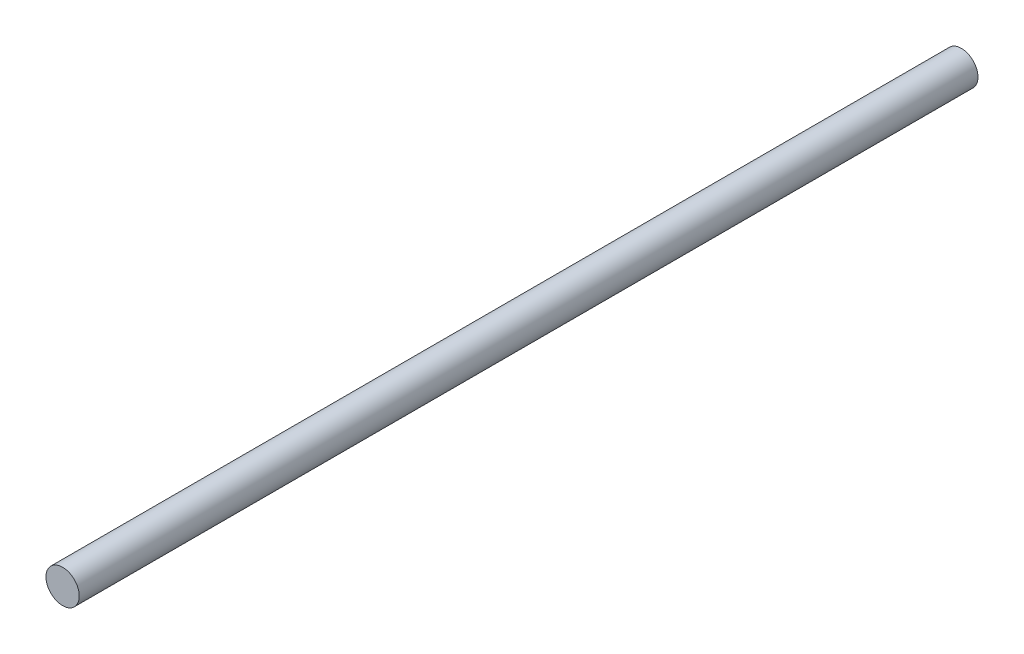
ISO-10303-21;
HEADER;
FILE_DESCRIPTION(('STEP AP214'),'2;1');
FILE_NAME('part.step','',(''),(''),'','','');
FILE_SCHEMA(('AUTOMOTIVE_DESIGN { 1 0 10303 214 1 1 1 1 }'));
ENDSEC;
DATA;
#1=APPLICATION_CONTEXT('core data for automotive mechanical design processes');
#2=APPLICATION_PROTOCOL_DEFINITION('international standard','automotive_design',2000,#1);
#3=PRODUCT_CONTEXT('',#1,'mechanical');
#4=PRODUCT('Part','Part','',(#3));
#5=PRODUCT_RELATED_PRODUCT_CATEGORY('part','',(#4));
#6=PRODUCT_DEFINITION_FORMATION('','',#4);
#7=PRODUCT_DEFINITION_CONTEXT('part definition',#1,'design');
#8=PRODUCT_DEFINITION('design','',#6,#7);
#9=PRODUCT_DEFINITION_SHAPE('','',#8);
#10=(LENGTH_UNIT() NAMED_UNIT(*) SI_UNIT(.MILLI.,.METRE.));
#11=(NAMED_UNIT(*) PLANE_ANGLE_UNIT() SI_UNIT($,.RADIAN.));
#12=(NAMED_UNIT(*) SI_UNIT($,.STERADIAN.) SOLID_ANGLE_UNIT());
#13=UNCERTAINTY_MEASURE_WITH_UNIT(LENGTH_MEASURE(1.E-05),#10,'distance_accuracy_value','');
#14=(GEOMETRIC_REPRESENTATION_CONTEXT(3) GLOBAL_UNCERTAINTY_ASSIGNED_CONTEXT((#13)) GLOBAL_UNIT_ASSIGNED_CONTEXT((#10,
#11,#12)) REPRESENTATION_CONTEXT('',''));
#15=CARTESIAN_POINT('',(0.,0.,0.));
#16=DIRECTION('',(0.,0.,1.));
#17=DIRECTION('',(1.,0.,0.));
#18=AXIS2_PLACEMENT_3D('',#15,#16,#17);
#19=CARTESIAN_POINT('',(0.,0.,81.));
#20=DIRECTION('',(0.,0.,-1.));
#21=DIRECTION('',(-1.,0.,0.));
#22=AXIS2_PLACEMENT_3D('',#19,#20,#21);
#23=CYLINDRICAL_SURFACE('',#22,1.5);
#24=CARTESIAN_POINT('',(0.,0.,81.));
#25=DIRECTION('',(0.,0.,1.));
#26=DIRECTION('',(1.,0.,0.));
#27=AXIS2_PLACEMENT_3D('',#24,#25,#26);
#28=CIRCLE('',#27,1.5);
#29=CARTESIAN_POINT('',(1.5,0.,81.));
#30=VERTEX_POINT('',#29);
#31=EDGE_CURVE('E10',#30,#30,#28,.T.);
#32=ORIENTED_EDGE('',*,*,#31,.F.);
#33=EDGE_LOOP('',(#32));
#34=FACE_BOUND('',#33,.T.);
#35=CARTESIAN_POINT('',(0.,0.,0.));
#36=DIRECTION('',(0.,0.,1.));
#37=DIRECTION('',(1.,0.,0.));
#38=AXIS2_PLACEMENT_3D('',#35,#36,#37);
#39=CIRCLE('',#38,1.5);
#40=CARTESIAN_POINT('',(1.5,0.,0.));
#41=VERTEX_POINT('',#40);
#42=EDGE_CURVE('E33',#41,#41,#39,.T.);
#43=ORIENTED_EDGE('',*,*,#42,.T.);
#44=EDGE_LOOP('',(#43));
#45=FACE_BOUND('',#44,.T.);
#46=ADVANCED_FACE('F30',(#34,#45),#23,.T.);
#47=CARTESIAN_POINT('',(0.,0.,81.));
#48=DIRECTION('',(0.,0.,1.));
#49=DIRECTION('',(1.,0.,0.));
#50=AXIS2_PLACEMENT_3D('',#47,#48,#49);
#51=PLANE('',#50);
#52=ORIENTED_EDGE('',*,*,#31,.T.);
#53=EDGE_LOOP('',(#52));
#54=FACE_BOUND('',#53,.T.);
#55=ADVANCED_FACE('F45',(#54),#51,.T.);
#56=CARTESIAN_POINT('',(0.,0.,0.));
#57=DIRECTION('',(0.,0.,1.));
#58=DIRECTION('',(1.,0.,0.));
#59=AXIS2_PLACEMENT_3D('',#56,#57,#58);
#60=PLANE('',#59);
#61=ORIENTED_EDGE('',*,*,#42,.F.);
#62=EDGE_LOOP('',(#61));
#63=FACE_BOUND('',#62,.T.);
#64=ADVANCED_FACE('F43',(#63),#60,.F.);
#65=CLOSED_SHELL('',(#46,#55,#64));
#66=MANIFOLD_SOLID_BREP('B2',#65);
#67=ADVANCED_BREP_SHAPE_REPRESENTATION('',(#18,#66),#14);
#68=SHAPE_DEFINITION_REPRESENTATION(#9,#67);
ENDSEC;
END-ISO-10303-21;
